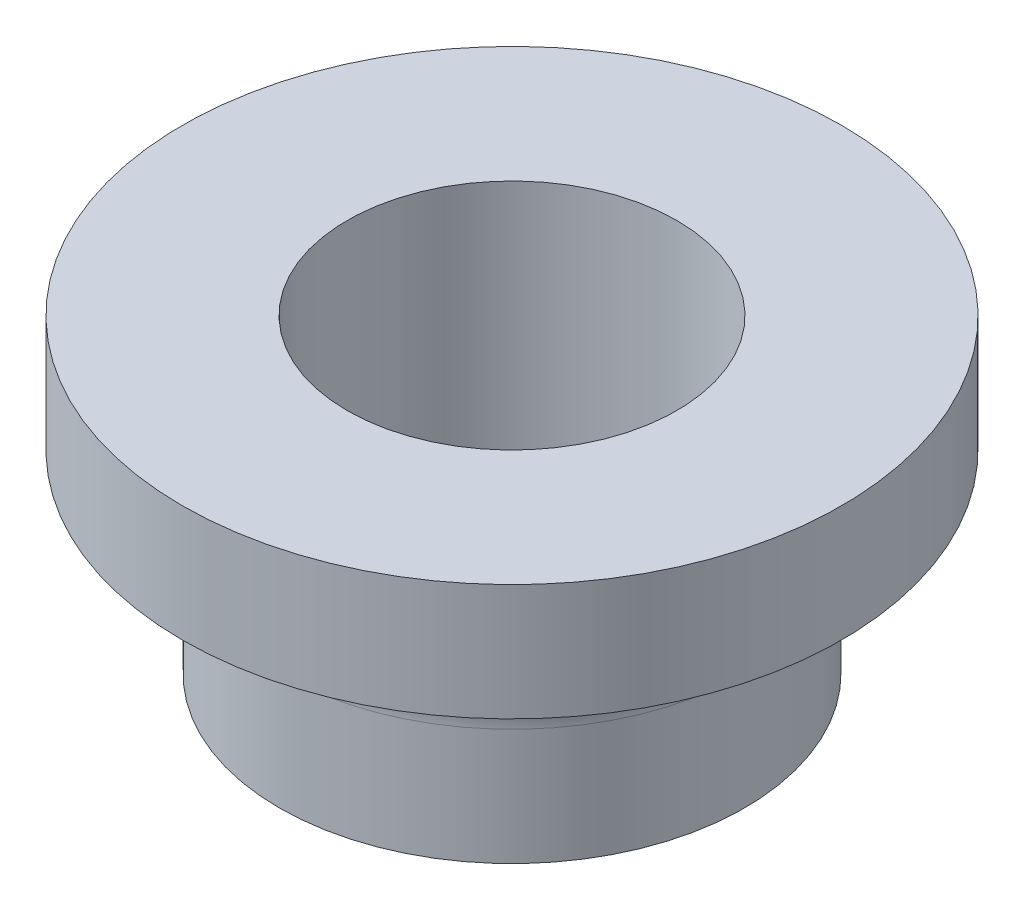
ISO-10303-21;
HEADER;
FILE_DESCRIPTION(('STEP AP214'),'2;1');
FILE_NAME('part.step','',(''),(''),'','','');
FILE_SCHEMA(('AUTOMOTIVE_DESIGN { 1 0 10303 214 1 1 1 1 }'));
ENDSEC;
DATA;
#1=APPLICATION_CONTEXT('core data for automotive mechanical design processes');
#2=APPLICATION_PROTOCOL_DEFINITION('international standard','automotive_design',2000,#1);
#3=PRODUCT_CONTEXT('',#1,'mechanical');
#4=PRODUCT('Part','Part','',(#3));
#5=PRODUCT_RELATED_PRODUCT_CATEGORY('part','',(#4));
#6=PRODUCT_DEFINITION_FORMATION('','',#4);
#7=PRODUCT_DEFINITION_CONTEXT('part definition',#1,'design');
#8=PRODUCT_DEFINITION('design','',#6,#7);
#9=PRODUCT_DEFINITION_SHAPE('','',#8);
#10=(LENGTH_UNIT() NAMED_UNIT(*) SI_UNIT(.MILLI.,.METRE.));
#11=(NAMED_UNIT(*) PLANE_ANGLE_UNIT() SI_UNIT($,.RADIAN.));
#12=(NAMED_UNIT(*) SI_UNIT($,.STERADIAN.) SOLID_ANGLE_UNIT());
#13=UNCERTAINTY_MEASURE_WITH_UNIT(LENGTH_MEASURE(1.E-05),#10,'distance_accuracy_value','');
#14=(GEOMETRIC_REPRESENTATION_CONTEXT(3) GLOBAL_UNCERTAINTY_ASSIGNED_CONTEXT((#13)) GLOBAL_UNIT_ASSIGNED_CONTEXT((#10,
#11,#12)) REPRESENTATION_CONTEXT('',''));
#15=CARTESIAN_POINT('',(0.,0.,0.));
#16=DIRECTION('',(0.,0.,1.));
#17=DIRECTION('',(1.,0.,0.));
#18=AXIS2_PLACEMENT_3D('',#15,#16,#17);
#19=CARTESIAN_POINT('',(0.,5.,0.));
#20=DIRECTION('',(0.,-1.,0.));
#21=DIRECTION('',(0.,0.,-1.));
#22=AXIS2_PLACEMENT_3D('',#19,#20,#21);
#23=CYLINDRICAL_SURFACE('',#22,6.);
#24=CARTESIAN_POINT('',(0.,3.,0.));
#25=DIRECTION('',(0.,1.,0.));
#26=DIRECTION('',(0.,0.,1.));
#27=AXIS2_PLACEMENT_3D('',#24,#25,#26);
#28=CIRCLE('',#27,6.);
#29=CARTESIAN_POINT('',(0.,3.,6.));
#30=VERTEX_POINT('',#29);
#31=EDGE_CURVE('E10',#30,#30,#28,.F.);
#32=ORIENTED_EDGE('',*,*,#31,.T.);
#33=EDGE_LOOP('',(#32));
#34=FACE_BOUND('',#33,.T.);
#35=CARTESIAN_POINT('',(0.,0.,0.));
#36=DIRECTION('',(0.,1.,0.));
#37=DIRECTION('',(0.,0.,1.));
#38=AXIS2_PLACEMENT_3D('',#35,#36,#37);
#39=CIRCLE('',#38,6.);
#40=CARTESIAN_POINT('',(0.,0.,6.));
#41=VERTEX_POINT('',#40);
#42=EDGE_CURVE('E43',#41,#41,#39,.T.);
#43=ORIENTED_EDGE('',*,*,#42,.T.);
#44=EDGE_LOOP('',(#43));
#45=FACE_BOUND('',#44,.T.);
#46=ADVANCED_FACE('F32',(#34,#45),#23,.T.);
#47=CARTESIAN_POINT('',(0.,0.,0.));
#48=DIRECTION('',(0.,1.,0.));
#49=DIRECTION('',(0.,0.,1.));
#50=AXIS2_PLACEMENT_3D('',#47,#48,#49);
#51=PLANE('',#50);
#52=CARTESIAN_POINT('',(0.,0.,0.));
#53=DIRECTION('',(0.,1.,0.));
#54=DIRECTION('',(0.,0.,1.));
#55=AXIS2_PLACEMENT_3D('',#52,#53,#54);
#56=CIRCLE('',#55,4.25);
#57=CARTESIAN_POINT('',(0.,0.,4.25));
#58=VERTEX_POINT('',#57);
#59=EDGE_CURVE('E53',#58,#58,#56,.T.);
#60=ORIENTED_EDGE('',*,*,#59,.T.);
#61=EDGE_LOOP('',(#60));
#62=FACE_BOUND('',#61,.T.);
#63=ORIENTED_EDGE('',*,*,#42,.F.);
#64=EDGE_LOOP('',(#63));
#65=FACE_BOUND('',#64,.T.);
#66=ADVANCED_FACE('F62',(#62,#65),#51,.F.);
#67=CARTESIAN_POINT('',(0.,8.,0.));
#68=DIRECTION('',(0.,-1.,0.));
#69=DIRECTION('',(0.,0.,-1.));
#70=AXIS2_PLACEMENT_3D('',#67,#68,#69);
#71=CYLINDRICAL_SURFACE('',#70,8.5);
#72=CARTESIAN_POINT('',(0.,8.,0.));
#73=DIRECTION('',(0.,1.,0.));
#74=DIRECTION('',(0.,0.,1.));
#75=AXIS2_PLACEMENT_3D('',#72,#73,#74);
#76=CIRCLE('',#75,8.5);
#77=CARTESIAN_POINT('',(0.,8.,8.5));
#78=VERTEX_POINT('',#77);
#79=EDGE_CURVE('E47',#78,#78,#76,.T.);
#80=ORIENTED_EDGE('',*,*,#79,.F.);
#81=EDGE_LOOP('',(#80));
#82=FACE_BOUND('',#81,.T.);
#83=CARTESIAN_POINT('',(0.,5.,0.));
#84=DIRECTION('',(0.,1.,0.));
#85=DIRECTION('',(0.,0.,1.));
#86=AXIS2_PLACEMENT_3D('',#83,#84,#85);
#87=CIRCLE('',#86,8.5);
#88=CARTESIAN_POINT('',(0.,5.,8.5));
#89=VERTEX_POINT('',#88);
#90=EDGE_CURVE('E50',#89,#89,#87,.T.);
#91=ORIENTED_EDGE('',*,*,#90,.T.);
#92=EDGE_LOOP('',(#91));
#93=FACE_BOUND('',#92,.T.);
#94=ADVANCED_FACE('F75',(#82,#93),#71,.T.);
#95=CARTESIAN_POINT('',(0.,8.,0.));
#96=DIRECTION('',(0.,1.,0.));
#97=DIRECTION('',(0.,0.,1.));
#98=AXIS2_PLACEMENT_3D('',#95,#96,#97);
#99=PLANE('',#98);
#100=CARTESIAN_POINT('',(0.,8.,0.));
#101=DIRECTION('',(0.,1.,0.));
#102=DIRECTION('',(0.,0.,1.));
#103=AXIS2_PLACEMENT_3D('',#100,#101,#102);
#104=CIRCLE('',#103,4.25);
#105=CARTESIAN_POINT('',(0.,8.,4.25));
#106=VERTEX_POINT('',#105);
#107=EDGE_CURVE('E56',#106,#106,#104,.T.);
#108=ORIENTED_EDGE('',*,*,#107,.F.);
#109=EDGE_LOOP('',(#108));
#110=FACE_BOUND('',#109,.T.);
#111=ORIENTED_EDGE('',*,*,#79,.T.);
#112=EDGE_LOOP('',(#111));
#113=FACE_BOUND('',#112,.T.);
#114=ADVANCED_FACE('F71',(#110,#113),#99,.T.);
#115=CARTESIAN_POINT('',(0.,5.,0.));
#116=DIRECTION('',(0.,1.,0.));
#117=DIRECTION('',(0.,0.,1.));
#118=AXIS2_PLACEMENT_3D('',#115,#116,#117);
#119=PLANE('',#118);
#120=CARTESIAN_POINT('',(0.,5.,0.));
#121=DIRECTION('',(0.,1.,0.));
#122=DIRECTION('',(0.,0.,1.));
#123=AXIS2_PLACEMENT_3D('',#120,#121,#122);
#124=CIRCLE('',#123,8.);
#125=CARTESIAN_POINT('',(0.,5.,8.));
#126=VERTEX_POINT('',#125);
#127=EDGE_CURVE('E39',#126,#126,#124,.T.);
#128=ORIENTED_EDGE('',*,*,#127,.T.);
#129=EDGE_LOOP('',(#128));
#130=FACE_BOUND('',#129,.T.);
#131=ORIENTED_EDGE('',*,*,#90,.F.);
#132=EDGE_LOOP('',(#131));
#133=FACE_BOUND('',#132,.T.);
#134=ADVANCED_FACE('F74',(#130,#133),#119,.F.);
#135=CARTESIAN_POINT('',(0.,3.,0.));
#136=DIRECTION('',(0.,1.,0.));
#137=DIRECTION('',(0.,0.,1.));
#138=AXIS2_PLACEMENT_3D('',#135,#136,#137);
#139=TOROIDAL_SURFACE('',#138,8.,2.);
#140=ORIENTED_EDGE('',*,*,#31,.F.);
#141=EDGE_LOOP('',(#140));
#142=FACE_BOUND('',#141,.T.);
#143=ORIENTED_EDGE('',*,*,#127,.F.);
#144=EDGE_LOOP('',(#143));
#145=FACE_BOUND('',#144,.T.);
#146=ADVANCED_FACE('F34',(#142,#145),#139,.F.);
#147=CARTESIAN_POINT('',(0.,0.,0.));
#148=DIRECTION('',(0.,1.,0.));
#149=DIRECTION('',(0.,0.,1.));
#150=AXIS2_PLACEMENT_3D('',#147,#148,#149);
#151=CYLINDRICAL_SURFACE('',#150,4.25);
#152=ORIENTED_EDGE('',*,*,#59,.F.);
#153=EDGE_LOOP('',(#152));
#154=FACE_BOUND('',#153,.T.);
#155=ORIENTED_EDGE('',*,*,#107,.T.);
#156=EDGE_LOOP('',(#155));
#157=FACE_BOUND('',#156,.T.);
#158=ADVANCED_FACE('F65',(#154,#157),#151,.F.);
#159=CLOSED_SHELL('',(#46,#66,#94,#114,#134,#146,#158));
#160=MANIFOLD_SOLID_BREP('B2',#159);
#161=ADVANCED_BREP_SHAPE_REPRESENTATION('',(#18,#160),#14);
#162=SHAPE_DEFINITION_REPRESENTATION(#9,#161);
ENDSEC;
END-ISO-10303-21;
